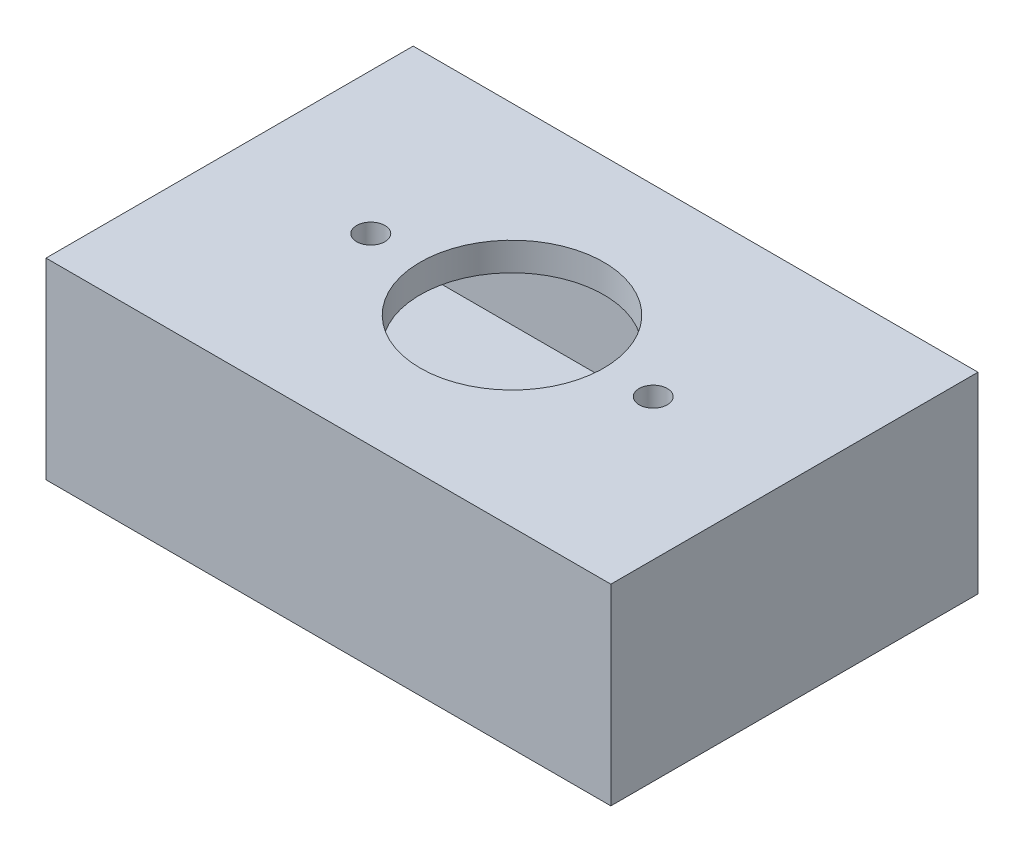
ISO-10303-21;
HEADER;
FILE_DESCRIPTION(('STEP AP214'),'2;1');
FILE_NAME('part.step','',(''),(''),'','','');
FILE_SCHEMA(('AUTOMOTIVE_DESIGN { 1 0 10303 214 1 1 1 1 }'));
ENDSEC;
DATA;
#1=APPLICATION_CONTEXT('core data for automotive mechanical design processes');
#2=APPLICATION_PROTOCOL_DEFINITION('international standard','automotive_design',2000,#1);
#3=PRODUCT_CONTEXT('',#1,'mechanical');
#4=PRODUCT('Part','Part','',(#3));
#5=PRODUCT_RELATED_PRODUCT_CATEGORY('part','',(#4));
#6=PRODUCT_DEFINITION_FORMATION('','',#4);
#7=PRODUCT_DEFINITION_CONTEXT('part definition',#1,'design');
#8=PRODUCT_DEFINITION('design','',#6,#7);
#9=PRODUCT_DEFINITION_SHAPE('','',#8);
#10=(LENGTH_UNIT() NAMED_UNIT(*) SI_UNIT(.MILLI.,.METRE.));
#11=(NAMED_UNIT(*) PLANE_ANGLE_UNIT() SI_UNIT($,.RADIAN.));
#12=(NAMED_UNIT(*) SI_UNIT($,.STERADIAN.) SOLID_ANGLE_UNIT());
#13=UNCERTAINTY_MEASURE_WITH_UNIT(LENGTH_MEASURE(1.E-05),#10,'distance_accuracy_value','');
#14=(GEOMETRIC_REPRESENTATION_CONTEXT(3) GLOBAL_UNCERTAINTY_ASSIGNED_CONTEXT((#13)) GLOBAL_UNIT_ASSIGNED_CONTEXT((#10,
#11,#12)) REPRESENTATION_CONTEXT('',''));
#15=CARTESIAN_POINT('',(0.,0.,0.));
#16=DIRECTION('',(0.,0.,1.));
#17=DIRECTION('',(1.,0.,0.));
#18=AXIS2_PLACEMENT_3D('',#15,#16,#17);
#19=CARTESIAN_POINT('',(0.,58.,0.));
#20=DIRECTION('',(0.,1.,0.));
#21=DIRECTION('',(0.,0.,1.));
#22=AXIS2_PLACEMENT_3D('',#19,#20,#21);
#23=PLANE('',#22);
#24=CARTESIAN_POINT('',(-50.,58.,0.));
#25=DIRECTION('',(0.,1.,0.));
#26=DIRECTION('',(0.,0.,1.));
#27=AXIS2_PLACEMENT_3D('',#24,#25,#26);
#28=CIRCLE('',#27,5.);
#29=CARTESIAN_POINT('',(-50.,58.,5.));
#30=VERTEX_POINT('',#29);
#31=EDGE_CURVE('E134',#30,#30,#28,.F.);
#32=ORIENTED_EDGE('',*,*,#31,.F.);
#33=EDGE_LOOP('',(#32));
#34=FACE_BOUND('',#33,.T.);
#35=CARTESIAN_POINT('',(50.,58.,0.));
#36=DIRECTION('',(0.,1.,0.));
#37=DIRECTION('',(0.,0.,1.));
#38=AXIS2_PLACEMENT_3D('',#35,#36,#37);
#39=CIRCLE('',#38,5.);
#40=CARTESIAN_POINT('',(50.,58.,5.));
#41=VERTEX_POINT('',#40);
#42=EDGE_CURVE('E446',#41,#41,#39,.F.);
#43=ORIENTED_EDGE('',*,*,#42,.F.);
#44=EDGE_LOOP('',(#43));
#45=FACE_BOUND('',#44,.T.);
#46=DIRECTION('',(0.,0.,-1.));
#47=VECTOR('',#46,1.);
#48=CARTESIAN_POINT('',(90.,58.,-65.));
#49=LINE('',#48,#47);
#50=CARTESIAN_POINT('',(90.,58.,55.));
#51=VERTEX_POINT('',#50);
#52=CARTESIAN_POINT('',(90.,58.,-55.));
#53=VERTEX_POINT('',#52);
#54=EDGE_CURVE('E211',#51,#53,#49,.T.);
#55=ORIENTED_EDGE('',*,*,#54,.F.);
#56=DIRECTION('',(1.,0.,0.));
#57=VECTOR('',#56,1.);
#58=CARTESIAN_POINT('',(-100.,58.,55.));
#59=LINE('',#58,#57);
#60=CARTESIAN_POINT('',(-90.,58.,55.));
#61=VERTEX_POINT('',#60);
#62=EDGE_CURVE('E196',#61,#51,#59,.T.);
#63=ORIENTED_EDGE('',*,*,#62,.F.);
#64=DIRECTION('',(0.,0.,1.));
#65=VECTOR('',#64,1.);
#66=CARTESIAN_POINT('',(-90.,58.,-65.));
#67=LINE('',#66,#65);
#68=CARTESIAN_POINT('',(-90.,58.,-55.));
#69=VERTEX_POINT('',#68);
#70=EDGE_CURVE('E219',#69,#61,#67,.T.);
#71=ORIENTED_EDGE('',*,*,#70,.F.);
#72=DIRECTION('',(-1.,0.,0.));
#73=VECTOR('',#72,1.);
#74=CARTESIAN_POINT('',(-100.,58.,-55.));
#75=LINE('',#74,#73);
#76=EDGE_CURVE('E215',#53,#69,#75,.T.);
#77=ORIENTED_EDGE('',*,*,#76,.F.);
#78=EDGE_LOOP('',(#55,#63,#71,#77));
#79=FACE_BOUND('',#78,.T.);
#80=CARTESIAN_POINT('',(0.,58.,0.));
#81=DIRECTION('',(0.,1.,0.));
#82=DIRECTION('',(0.,0.,1.));
#83=AXIS2_PLACEMENT_3D('',#80,#81,#82);
#84=CIRCLE('',#83,32.5);
#85=CARTESIAN_POINT('',(0.,58.,32.5));
#86=VERTEX_POINT('',#85);
#87=EDGE_CURVE('E441',#86,#86,#84,.F.);
#88=ORIENTED_EDGE('',*,*,#87,.F.);
#89=EDGE_LOOP('',(#88));
#90=FACE_BOUND('',#89,.T.);
#91=ADVANCED_FACE('F45',(#34,#45,#79,#90),#23,.F.);
#92=CARTESIAN_POINT('',(100.,58.,-65.));
#93=DIRECTION('',(-1.,0.,0.));
#94=DIRECTION('',(0.,0.,1.));
#95=AXIS2_PLACEMENT_3D('',#92,#93,#94);
#96=PLANE('',#95);
#97=DIRECTION('',(0.,0.,-1.));
#98=VECTOR('',#97,1.);
#99=CARTESIAN_POINT('',(100.,0.,-65.));
#100=LINE('',#99,#98);
#101=CARTESIAN_POINT('',(100.,0.,65.));
#102=VERTEX_POINT('',#101);
#103=CARTESIAN_POINT('',(100.,0.,-65.));
#104=VERTEX_POINT('',#103);
#105=EDGE_CURVE('E189',#102,#104,#100,.T.);
#106=ORIENTED_EDGE('',*,*,#105,.T.);
#107=DIRECTION('',(0.,-1.,0.));
#108=VECTOR('',#107,1.);
#109=CARTESIAN_POINT('',(100.,58.,-65.));
#110=LINE('',#109,#108);
#111=CARTESIAN_POINT('',(100.,68.,-65.));
#112=VERTEX_POINT('',#111);
#113=EDGE_CURVE('E11',#112,#104,#110,.T.);
#114=ORIENTED_EDGE('',*,*,#113,.F.);
#115=DIRECTION('',(0.,0.,-1.));
#116=VECTOR('',#115,1.);
#117=CARTESIAN_POINT('',(100.,68.,65.));
#118=LINE('',#117,#116);
#119=CARTESIAN_POINT('',(100.,68.,65.));
#120=VERTEX_POINT('',#119);
#121=EDGE_CURVE('E122',#120,#112,#118,.T.);
#122=ORIENTED_EDGE('',*,*,#121,.F.);
#123=DIRECTION('',(0.,-1.,0.));
#124=VECTOR('',#123,1.);
#125=CARTESIAN_POINT('',(100.,58.,65.));
#126=LINE('',#125,#124);
#127=EDGE_CURVE('E110',#120,#102,#126,.T.);
#128=ORIENTED_EDGE('',*,*,#127,.T.);
#129=EDGE_LOOP('',(#106,#114,#122,#128));
#130=FACE_BOUND('',#129,.T.);
#131=ADVANCED_FACE('F47',(#130),#96,.F.);
#132=CARTESIAN_POINT('',(-100.,58.,-65.));
#133=DIRECTION('',(0.,0.,1.));
#134=DIRECTION('',(1.,0.,0.));
#135=AXIS2_PLACEMENT_3D('',#132,#133,#134);
#136=PLANE('',#135);
#137=DIRECTION('',(-1.,0.,0.));
#138=VECTOR('',#137,1.);
#139=CARTESIAN_POINT('',(-100.,0.,-65.));
#140=LINE('',#139,#138);
#141=CARTESIAN_POINT('',(-100.,0.,-65.));
#142=VERTEX_POINT('',#141);
#143=EDGE_CURVE('E228',#104,#142,#140,.T.);
#144=ORIENTED_EDGE('',*,*,#143,.T.);
#145=DIRECTION('',(0.,-1.,0.));
#146=VECTOR('',#145,1.);
#147=CARTESIAN_POINT('',(-100.,58.,-65.));
#148=LINE('',#147,#146);
#149=CARTESIAN_POINT('',(-100.,68.,-65.));
#150=VERTEX_POINT('',#149);
#151=EDGE_CURVE('E54',#150,#142,#148,.T.);
#152=ORIENTED_EDGE('',*,*,#151,.F.);
#153=DIRECTION('',(-1.,0.,0.));
#154=VECTOR('',#153,1.);
#155=CARTESIAN_POINT('',(100.,68.,-65.));
#156=LINE('',#155,#154);
#157=EDGE_CURVE('E127',#112,#150,#156,.T.);
#158=ORIENTED_EDGE('',*,*,#157,.F.);
#159=ORIENTED_EDGE('',*,*,#113,.T.);
#160=EDGE_LOOP('',(#144,#152,#158,#159));
#161=FACE_BOUND('',#160,.T.);
#162=ADVANCED_FACE('F241',(#161),#136,.F.);
#163=CARTESIAN_POINT('',(-100.,58.,-65.));
#164=DIRECTION('',(1.,0.,0.));
#165=DIRECTION('',(0.,0.,-1.));
#166=AXIS2_PLACEMENT_3D('',#163,#164,#165);
#167=PLANE('',#166);
#168=DIRECTION('',(0.,0.,1.));
#169=VECTOR('',#168,1.);
#170=CARTESIAN_POINT('',(-100.,0.,-65.));
#171=LINE('',#170,#169);
#172=CARTESIAN_POINT('',(-100.,0.,65.));
#173=VERTEX_POINT('',#172);
#174=EDGE_CURVE('E69',#142,#173,#171,.T.);
#175=ORIENTED_EDGE('',*,*,#174,.T.);
#176=DIRECTION('',(0.,-1.,0.));
#177=VECTOR('',#176,1.);
#178=CARTESIAN_POINT('',(-100.,58.,65.));
#179=LINE('',#178,#177);
#180=CARTESIAN_POINT('',(-100.,68.,65.));
#181=VERTEX_POINT('',#180);
#182=EDGE_CURVE('E119',#181,#173,#179,.T.);
#183=ORIENTED_EDGE('',*,*,#182,.F.);
#184=DIRECTION('',(0.,0.,1.));
#185=VECTOR('',#184,1.);
#186=CARTESIAN_POINT('',(-100.,68.,-65.));
#187=LINE('',#186,#185);
#188=EDGE_CURVE('E132',#150,#181,#187,.T.);
#189=ORIENTED_EDGE('',*,*,#188,.F.);
#190=ORIENTED_EDGE('',*,*,#151,.T.);
#191=EDGE_LOOP('',(#175,#183,#189,#190));
#192=FACE_BOUND('',#191,.T.);
#193=ADVANCED_FACE('F237',(#192),#167,.F.);
#194=CARTESIAN_POINT('',(-100.,58.,65.));
#195=DIRECTION('',(0.,0.,-1.));
#196=DIRECTION('',(-1.,0.,0.));
#197=AXIS2_PLACEMENT_3D('',#194,#195,#196);
#198=PLANE('',#197);
#199=DIRECTION('',(1.,0.,0.));
#200=VECTOR('',#199,1.);
#201=CARTESIAN_POINT('',(-100.,0.,65.));
#202=LINE('',#201,#200);
#203=EDGE_CURVE('E61',#173,#102,#202,.T.);
#204=ORIENTED_EDGE('',*,*,#203,.T.);
#205=ORIENTED_EDGE('',*,*,#127,.F.);
#206=DIRECTION('',(1.,0.,0.));
#207=VECTOR('',#206,1.);
#208=CARTESIAN_POINT('',(-100.,68.,65.));
#209=LINE('',#208,#207);
#210=EDGE_CURVE('E114',#181,#120,#209,.T.);
#211=ORIENTED_EDGE('',*,*,#210,.F.);
#212=ORIENTED_EDGE('',*,*,#182,.T.);
#213=EDGE_LOOP('',(#204,#205,#211,#212));
#214=FACE_BOUND('',#213,.T.);
#215=ADVANCED_FACE('F112',(#214),#198,.F.);
#216=CARTESIAN_POINT('',(0.,0.,0.));
#217=DIRECTION('',(0.,1.,0.));
#218=DIRECTION('',(0.,0.,1.));
#219=AXIS2_PLACEMENT_3D('',#216,#217,#218);
#220=PLANE('',#219);
#221=CARTESIAN_POINT('',(15.5,0.,-15.5));
#222=DIRECTION('',(0.,1.,0.));
#223=DIRECTION('',(0.,0.,1.));
#224=AXIS2_PLACEMENT_3D('',#221,#222,#223);
#225=CIRCLE('',#224,1.5);
#226=CARTESIAN_POINT('',(15.5,0.,-14.));
#227=VERTEX_POINT('',#226);
#228=EDGE_CURVE('E162',#227,#227,#225,.T.);
#229=ORIENTED_EDGE('',*,*,#228,.T.);
#230=EDGE_LOOP('',(#229));
#231=FACE_BOUND('',#230,.T.);
#232=CARTESIAN_POINT('',(-15.5,0.,15.5));
#233=DIRECTION('',(0.,1.,0.));
#234=DIRECTION('',(0.,0.,1.));
#235=AXIS2_PLACEMENT_3D('',#232,#233,#234);
#236=CIRCLE('',#235,1.5);
#237=CARTESIAN_POINT('',(-15.5,0.,17.));
#238=VERTEX_POINT('',#237);
#239=EDGE_CURVE('E153',#238,#238,#236,.T.);
#240=ORIENTED_EDGE('',*,*,#239,.T.);
#241=EDGE_LOOP('',(#240));
#242=FACE_BOUND('',#241,.T.);
#243=CARTESIAN_POINT('',(15.5,0.,15.5));
#244=DIRECTION('',(0.,1.,0.));
#245=DIRECTION('',(0.,0.,1.));
#246=AXIS2_PLACEMENT_3D('',#243,#244,#245);
#247=CIRCLE('',#246,1.5);
#248=CARTESIAN_POINT('',(15.5,0.,17.));
#249=VERTEX_POINT('',#248);
#250=EDGE_CURVE('E148',#249,#249,#247,.T.);
#251=ORIENTED_EDGE('',*,*,#250,.T.);
#252=EDGE_LOOP('',(#251));
#253=FACE_BOUND('',#252,.T.);
#254=CARTESIAN_POINT('',(-15.5,0.,-15.5));
#255=DIRECTION('',(0.,1.,0.));
#256=DIRECTION('',(0.,0.,1.));
#257=AXIS2_PLACEMENT_3D('',#254,#255,#256);
#258=CIRCLE('',#257,1.5);
#259=CARTESIAN_POINT('',(-15.5,0.,-14.));
#260=VERTEX_POINT('',#259);
#261=EDGE_CURVE('E173',#260,#260,#258,.T.);
#262=ORIENTED_EDGE('',*,*,#261,.T.);
#263=EDGE_LOOP('',(#262));
#264=FACE_BOUND('',#263,.T.);
#265=ORIENTED_EDGE('',*,*,#105,.F.);
#266=ORIENTED_EDGE('',*,*,#203,.F.);
#267=ORIENTED_EDGE('',*,*,#174,.F.);
#268=ORIENTED_EDGE('',*,*,#143,.F.);
#269=EDGE_LOOP('',(#265,#266,#267,#268));
#270=FACE_BOUND('',#269,.T.);
#271=ADVANCED_FACE('F240',(#231,#242,#253,#264,#270),#220,.F.);
#272=CARTESIAN_POINT('',(90.,58.,-65.));
#273=DIRECTION('',(-1.,0.,0.));
#274=DIRECTION('',(0.,0.,1.));
#275=AXIS2_PLACEMENT_3D('',#272,#273,#274);
#276=PLANE('',#275);
#277=DIRECTION('',(0.,0.,-1.));
#278=VECTOR('',#277,1.);
#279=CARTESIAN_POINT('',(90.,10.,-65.));
#280=LINE('',#279,#278);
#281=CARTESIAN_POINT('',(90.,10.,55.));
#282=VERTEX_POINT('',#281);
#283=CARTESIAN_POINT('',(90.,10.,-55.));
#284=VERTEX_POINT('',#283);
#285=EDGE_CURVE('E177',#282,#284,#280,.T.);
#286=ORIENTED_EDGE('',*,*,#285,.F.);
#287=DIRECTION('',(0.,-1.,0.));
#288=VECTOR('',#287,1.);
#289=CARTESIAN_POINT('',(90.,58.,55.));
#290=LINE('',#289,#288);
#291=EDGE_CURVE('E191',#51,#282,#290,.T.);
#292=ORIENTED_EDGE('',*,*,#291,.F.);
#293=ORIENTED_EDGE('',*,*,#54,.T.);
#294=DIRECTION('',(0.,-1.,0.));
#295=VECTOR('',#294,1.);
#296=CARTESIAN_POINT('',(90.,58.,-55.));
#297=LINE('',#296,#295);
#298=EDGE_CURVE('E185',#53,#284,#297,.T.);
#299=ORIENTED_EDGE('',*,*,#298,.T.);
#300=EDGE_LOOP('',(#286,#292,#293,#299));
#301=FACE_BOUND('',#300,.T.);
#302=ADVANCED_FACE('F277',(#301),#276,.T.);
#303=CARTESIAN_POINT('',(-100.,58.,-55.));
#304=DIRECTION('',(0.,0.,1.));
#305=DIRECTION('',(1.,0.,0.));
#306=AXIS2_PLACEMENT_3D('',#303,#304,#305);
#307=PLANE('',#306);
#308=DIRECTION('',(-1.,0.,0.));
#309=VECTOR('',#308,1.);
#310=CARTESIAN_POINT('',(-100.,10.,-55.));
#311=LINE('',#310,#309);
#312=CARTESIAN_POINT('',(-90.,10.,-55.));
#313=VERTEX_POINT('',#312);
#314=EDGE_CURVE('E184',#284,#313,#311,.T.);
#315=ORIENTED_EDGE('',*,*,#314,.F.);
#316=ORIENTED_EDGE('',*,*,#298,.F.);
#317=ORIENTED_EDGE('',*,*,#76,.T.);
#318=DIRECTION('',(0.,-1.,0.));
#319=VECTOR('',#318,1.);
#320=CARTESIAN_POINT('',(-90.,58.,-55.));
#321=LINE('',#320,#319);
#322=EDGE_CURVE('E190',#69,#313,#321,.T.);
#323=ORIENTED_EDGE('',*,*,#322,.T.);
#324=EDGE_LOOP('',(#315,#316,#317,#323));
#325=FACE_BOUND('',#324,.T.);
#326=ADVANCED_FACE('F280',(#325),#307,.T.);
#327=CARTESIAN_POINT('',(-90.,58.,-65.));
#328=DIRECTION('',(1.,0.,0.));
#329=DIRECTION('',(0.,0.,-1.));
#330=AXIS2_PLACEMENT_3D('',#327,#328,#329);
#331=PLANE('',#330);
#332=DIRECTION('',(0.,0.,1.));
#333=VECTOR('',#332,1.);
#334=CARTESIAN_POINT('',(-90.,10.,-65.));
#335=LINE('',#334,#333);
#336=CARTESIAN_POINT('',(-90.,10.,55.));
#337=VERTEX_POINT('',#336);
#338=EDGE_CURVE('E199',#313,#337,#335,.T.);
#339=ORIENTED_EDGE('',*,*,#338,.F.);
#340=ORIENTED_EDGE('',*,*,#322,.F.);
#341=ORIENTED_EDGE('',*,*,#70,.T.);
#342=DIRECTION('',(0.,-1.,0.));
#343=VECTOR('',#342,1.);
#344=CARTESIAN_POINT('',(-90.,58.,55.));
#345=LINE('',#344,#343);
#346=EDGE_CURVE('E195',#61,#337,#345,.T.);
#347=ORIENTED_EDGE('',*,*,#346,.T.);
#348=EDGE_LOOP('',(#339,#340,#341,#347));
#349=FACE_BOUND('',#348,.T.);
#350=ADVANCED_FACE('F284',(#349),#331,.T.);
#351=CARTESIAN_POINT('',(-100.,58.,55.));
#352=DIRECTION('',(0.,0.,-1.));
#353=DIRECTION('',(-1.,0.,0.));
#354=AXIS2_PLACEMENT_3D('',#351,#352,#353);
#355=PLANE('',#354);
#356=DIRECTION('',(1.,0.,0.));
#357=VECTOR('',#356,1.);
#358=CARTESIAN_POINT('',(-100.,10.,55.));
#359=LINE('',#358,#357);
#360=EDGE_CURVE('E205',#337,#282,#359,.T.);
#361=ORIENTED_EDGE('',*,*,#360,.F.);
#362=ORIENTED_EDGE('',*,*,#346,.F.);
#363=ORIENTED_EDGE('',*,*,#62,.T.);
#364=ORIENTED_EDGE('',*,*,#291,.T.);
#365=EDGE_LOOP('',(#361,#362,#363,#364));
#366=FACE_BOUND('',#365,.T.);
#367=ADVANCED_FACE('F288',(#366),#355,.T.);
#368=CARTESIAN_POINT('',(0.,10.,0.));
#369=DIRECTION('',(0.,1.,0.));
#370=DIRECTION('',(0.,0.,1.));
#371=AXIS2_PLACEMENT_3D('',#368,#369,#370);
#372=PLANE('',#371);
#373=CARTESIAN_POINT('',(15.5,10.,-15.5));
#374=DIRECTION('',(0.,1.,0.));
#375=DIRECTION('',(0.,0.,1.));
#376=AXIS2_PLACEMENT_3D('',#373,#374,#375);
#377=CIRCLE('',#376,1.5);
#378=CARTESIAN_POINT('',(15.5,10.,-14.));
#379=VERTEX_POINT('',#378);
#380=EDGE_CURVE('E157',#379,#379,#377,.T.);
#381=ORIENTED_EDGE('',*,*,#380,.F.);
#382=EDGE_LOOP('',(#381));
#383=FACE_BOUND('',#382,.T.);
#384=CARTESIAN_POINT('',(-15.5,10.,15.5));
#385=DIRECTION('',(0.,1.,0.));
#386=DIRECTION('',(0.,0.,1.));
#387=AXIS2_PLACEMENT_3D('',#384,#385,#386);
#388=CIRCLE('',#387,1.5);
#389=CARTESIAN_POINT('',(-15.5,10.,17.));
#390=VERTEX_POINT('',#389);
#391=EDGE_CURVE('E166',#390,#390,#388,.T.);
#392=ORIENTED_EDGE('',*,*,#391,.F.);
#393=EDGE_LOOP('',(#392));
#394=FACE_BOUND('',#393,.T.);
#395=CARTESIAN_POINT('',(15.5,10.,15.5));
#396=DIRECTION('',(0.,1.,0.));
#397=DIRECTION('',(0.,0.,1.));
#398=AXIS2_PLACEMENT_3D('',#395,#396,#397);
#399=CIRCLE('',#398,1.5);
#400=CARTESIAN_POINT('',(15.5,10.,17.));
#401=VERTEX_POINT('',#400);
#402=EDGE_CURVE('E149',#401,#401,#399,.T.);
#403=ORIENTED_EDGE('',*,*,#402,.F.);
#404=EDGE_LOOP('',(#403));
#405=FACE_BOUND('',#404,.T.);
#406=CARTESIAN_POINT('',(-15.5,10.,-15.5));
#407=DIRECTION('',(0.,1.,0.));
#408=DIRECTION('',(0.,0.,1.));
#409=AXIS2_PLACEMENT_3D('',#406,#407,#408);
#410=CIRCLE('',#409,1.5);
#411=CARTESIAN_POINT('',(-15.5,10.,-14.));
#412=VERTEX_POINT('',#411);
#413=EDGE_CURVE('E161',#412,#412,#410,.T.);
#414=ORIENTED_EDGE('',*,*,#413,.F.);
#415=EDGE_LOOP('',(#414));
#416=FACE_BOUND('',#415,.T.);
#417=ORIENTED_EDGE('',*,*,#285,.T.);
#418=ORIENTED_EDGE('',*,*,#314,.T.);
#419=ORIENTED_EDGE('',*,*,#338,.T.);
#420=ORIENTED_EDGE('',*,*,#360,.T.);
#421=EDGE_LOOP('',(#417,#418,#419,#420));
#422=FACE_BOUND('',#421,.T.);
#423=ADVANCED_FACE('F275',(#383,#394,#405,#416,#422),#372,.T.);
#424=CARTESIAN_POINT('',(-15.5,0.,-15.5));
#425=DIRECTION('',(0.,1.,0.));
#426=DIRECTION('',(0.,0.,1.));
#427=AXIS2_PLACEMENT_3D('',#424,#425,#426);
#428=CYLINDRICAL_SURFACE('',#427,1.5);
#429=ORIENTED_EDGE('',*,*,#261,.F.);
#430=EDGE_LOOP('',(#429));
#431=FACE_BOUND('',#430,.T.);
#432=ORIENTED_EDGE('',*,*,#413,.T.);
#433=EDGE_LOOP('',(#432));
#434=FACE_BOUND('',#433,.T.);
#435=ADVANCED_FACE('F264',(#431,#434),#428,.F.);
#436=CARTESIAN_POINT('',(15.5,0.,15.5));
#437=DIRECTION('',(0.,1.,0.));
#438=DIRECTION('',(0.,0.,1.));
#439=AXIS2_PLACEMENT_3D('',#436,#437,#438);
#440=CYLINDRICAL_SURFACE('',#439,1.5);
#441=ORIENTED_EDGE('',*,*,#250,.F.);
#442=EDGE_LOOP('',(#441));
#443=FACE_BOUND('',#442,.T.);
#444=ORIENTED_EDGE('',*,*,#402,.T.);
#445=EDGE_LOOP('',(#444));
#446=FACE_BOUND('',#445,.T.);
#447=ADVANCED_FACE('F260',(#443,#446),#440,.F.);
#448=CARTESIAN_POINT('',(-15.5,0.,15.5));
#449=DIRECTION('',(0.,1.,0.));
#450=DIRECTION('',(0.,0.,1.));
#451=AXIS2_PLACEMENT_3D('',#448,#449,#450);
#452=CYLINDRICAL_SURFACE('',#451,1.5);
#453=ORIENTED_EDGE('',*,*,#239,.F.);
#454=EDGE_LOOP('',(#453));
#455=FACE_BOUND('',#454,.T.);
#456=ORIENTED_EDGE('',*,*,#391,.T.);
#457=EDGE_LOOP('',(#456));
#458=FACE_BOUND('',#457,.T.);
#459=ADVANCED_FACE('F263',(#455,#458),#452,.F.);
#460=CARTESIAN_POINT('',(15.5,0.,-15.5));
#461=DIRECTION('',(0.,1.,0.));
#462=DIRECTION('',(0.,0.,1.));
#463=AXIS2_PLACEMENT_3D('',#460,#461,#462);
#464=CYLINDRICAL_SURFACE('',#463,1.5);
#465=ORIENTED_EDGE('',*,*,#228,.F.);
#466=EDGE_LOOP('',(#465));
#467=FACE_BOUND('',#466,.T.);
#468=ORIENTED_EDGE('',*,*,#380,.T.);
#469=EDGE_LOOP('',(#468));
#470=FACE_BOUND('',#469,.T.);
#471=ADVANCED_FACE('F266',(#467,#470),#464,.F.);
#472=CARTESIAN_POINT('',(0.,68.,0.));
#473=DIRECTION('',(0.,1.,0.));
#474=DIRECTION('',(0.,0.,1.));
#475=AXIS2_PLACEMENT_3D('',#472,#473,#474);
#476=PLANE('',#475);
#477=CARTESIAN_POINT('',(-50.,68.,0.));
#478=DIRECTION('',(0.,1.,0.));
#479=DIRECTION('',(0.,0.,1.));
#480=AXIS2_PLACEMENT_3D('',#477,#478,#479);
#481=CIRCLE('',#480,5.);
#482=CARTESIAN_POINT('',(-50.,68.,5.));
#483=VERTEX_POINT('',#482);
#484=EDGE_CURVE('E138',#483,#483,#481,.T.);
#485=ORIENTED_EDGE('',*,*,#484,.F.);
#486=EDGE_LOOP('',(#485));
#487=FACE_BOUND('',#486,.T.);
#488=CARTESIAN_POINT('',(0.,68.,0.));
#489=DIRECTION('',(0.,1.,0.));
#490=DIRECTION('',(0.,0.,1.));
#491=AXIS2_PLACEMENT_3D('',#488,#489,#490);
#492=CIRCLE('',#491,32.5);
#493=CARTESIAN_POINT('',(0.,68.,32.5));
#494=VERTEX_POINT('',#493);
#495=EDGE_CURVE('E437',#494,#494,#492,.T.);
#496=ORIENTED_EDGE('',*,*,#495,.F.);
#497=EDGE_LOOP('',(#496));
#498=FACE_BOUND('',#497,.T.);
#499=CARTESIAN_POINT('',(50.,68.,0.));
#500=DIRECTION('',(0.,1.,0.));
#501=DIRECTION('',(0.,0.,1.));
#502=AXIS2_PLACEMENT_3D('',#499,#500,#501);
#503=CIRCLE('',#502,5.);
#504=CARTESIAN_POINT('',(50.,68.,5.));
#505=VERTEX_POINT('',#504);
#506=EDGE_CURVE('E141',#505,#505,#503,.T.);
#507=ORIENTED_EDGE('',*,*,#506,.F.);
#508=EDGE_LOOP('',(#507));
#509=FACE_BOUND('',#508,.T.);
#510=ORIENTED_EDGE('',*,*,#210,.T.);
#511=ORIENTED_EDGE('',*,*,#121,.T.);
#512=ORIENTED_EDGE('',*,*,#157,.T.);
#513=ORIENTED_EDGE('',*,*,#188,.T.);
#514=EDGE_LOOP('',(#510,#511,#512,#513));
#515=FACE_BOUND('',#514,.T.);
#516=ADVANCED_FACE('F130',(#487,#498,#509,#515),#476,.T.);
#517=CARTESIAN_POINT('',(50.,-0.001000000000001,0.));
#518=DIRECTION('',(0.,1.,0.));
#519=DIRECTION('',(0.,0.,1.));
#520=AXIS2_PLACEMENT_3D('',#517,#518,#519);
#521=CYLINDRICAL_SURFACE('',#520,5.);
#522=ORIENTED_EDGE('',*,*,#506,.T.);
#523=EDGE_LOOP('',(#522));
#524=FACE_BOUND('',#523,.T.);
#525=ORIENTED_EDGE('',*,*,#42,.T.);
#526=EDGE_LOOP('',(#525));
#527=FACE_BOUND('',#526,.T.);
#528=ADVANCED_FACE('F396',(#524,#527),#521,.F.);
#529=CARTESIAN_POINT('',(0.,-0.001000000000001,0.));
#530=DIRECTION('',(0.,1.,0.));
#531=DIRECTION('',(0.,0.,1.));
#532=AXIS2_PLACEMENT_3D('',#529,#530,#531);
#533=CYLINDRICAL_SURFACE('',#532,32.5);
#534=ORIENTED_EDGE('',*,*,#495,.T.);
#535=EDGE_LOOP('',(#534));
#536=FACE_BOUND('',#535,.T.);
#537=ORIENTED_EDGE('',*,*,#87,.T.);
#538=EDGE_LOOP('',(#537));
#539=FACE_BOUND('',#538,.T.);
#540=ADVANCED_FACE('F409',(#536,#539),#533,.F.);
#541=CARTESIAN_POINT('',(-50.,-0.001000000000001,0.));
#542=DIRECTION('',(0.,1.,0.));
#543=DIRECTION('',(0.,0.,1.));
#544=AXIS2_PLACEMENT_3D('',#541,#542,#543);
#545=CYLINDRICAL_SURFACE('',#544,5.);
#546=ORIENTED_EDGE('',*,*,#484,.T.);
#547=EDGE_LOOP('',(#546));
#548=FACE_BOUND('',#547,.T.);
#549=ORIENTED_EDGE('',*,*,#31,.T.);
#550=EDGE_LOOP('',(#549));
#551=FACE_BOUND('',#550,.T.);
#552=ADVANCED_FACE('F417',(#548,#551),#545,.F.);
#553=CLOSED_SHELL('',(#91,#131,#162,#193,#215,#271,#302,#326,#350,#367,#423,#435,#447,#459,#471,
#516,#528,#540,#552));
#554=MANIFOLD_SOLID_BREP('B2',#553);
#555=ADVANCED_BREP_SHAPE_REPRESENTATION('',(#18,#554),#14);
#556=SHAPE_DEFINITION_REPRESENTATION(#9,#555);
ENDSEC;
END-ISO-10303-21;
